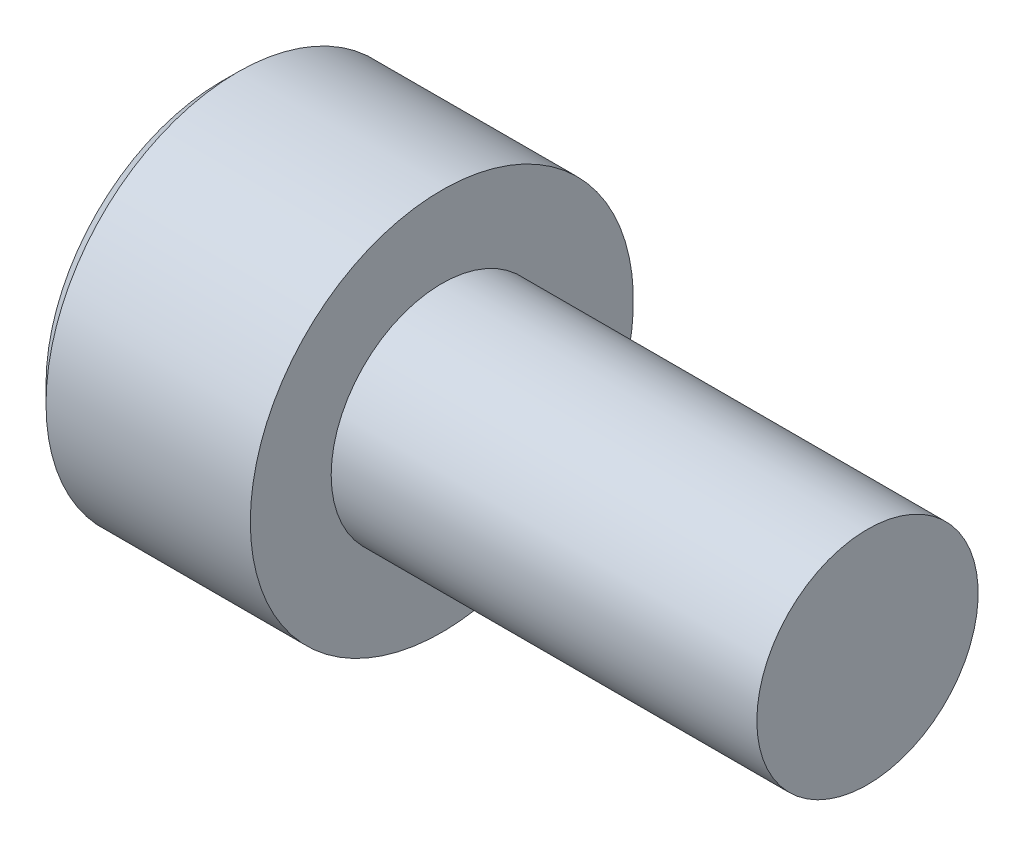
ISO-10303-21;
HEADER;
FILE_DESCRIPTION(('STEP AP214'),'2;1');
FILE_NAME('part.step','',(''),(''),'','','');
FILE_SCHEMA(('AUTOMOTIVE_DESIGN { 1 0 10303 214 1 1 1 1 }'));
ENDSEC;
DATA;
#1=APPLICATION_CONTEXT('core data for automotive mechanical design processes');
#2=APPLICATION_PROTOCOL_DEFINITION('international standard','automotive_design',2000,#1);
#3=PRODUCT_CONTEXT('',#1,'mechanical');
#4=PRODUCT('Part','Part','',(#3));
#5=PRODUCT_RELATED_PRODUCT_CATEGORY('part','',(#4));
#6=PRODUCT_DEFINITION_FORMATION('','',#4);
#7=PRODUCT_DEFINITION_CONTEXT('part definition',#1,'design');
#8=PRODUCT_DEFINITION('design','',#6,#7);
#9=PRODUCT_DEFINITION_SHAPE('','',#8);
#10=(LENGTH_UNIT() NAMED_UNIT(*) SI_UNIT(.MILLI.,.METRE.));
#11=(NAMED_UNIT(*) PLANE_ANGLE_UNIT() SI_UNIT($,.RADIAN.));
#12=(NAMED_UNIT(*) SI_UNIT($,.STERADIAN.) SOLID_ANGLE_UNIT());
#13=UNCERTAINTY_MEASURE_WITH_UNIT(LENGTH_MEASURE(1.E-05),#10,'distance_accuracy_value','');
#14=(GEOMETRIC_REPRESENTATION_CONTEXT(3) GLOBAL_UNCERTAINTY_ASSIGNED_CONTEXT((#13)) GLOBAL_UNIT_ASSIGNED_CONTEXT((#10,
#11,#12)) REPRESENTATION_CONTEXT('',''));
#15=CARTESIAN_POINT('',(0.,0.,0.));
#16=DIRECTION('',(0.,0.,1.));
#17=DIRECTION('',(1.,0.,0.));
#18=AXIS2_PLACEMENT_3D('',#15,#16,#17);
#19=CARTESIAN_POINT('',(-2.6,2.25,0.));
#20=DIRECTION('',(1.,0.,0.));
#21=DIRECTION('',(0.,0.,-1.));
#22=AXIS2_PLACEMENT_3D('',#19,#20,#21);
#23=PLANE('',#22);
#24=CARTESIAN_POINT('',(-2.6,0.,0.));
#25=DIRECTION('',(1.,0.,0.));
#26=DIRECTION('',(0.,0.,-1.));
#27=AXIS2_PLACEMENT_3D('',#24,#25,#26);
#28=CIRCLE('',#27,2.05);
#29=CARTESIAN_POINT('',(-2.6,0.,-2.05));
#30=VERTEX_POINT('',#29);
#31=EDGE_CURVE('E53',#30,#30,#28,.F.);
#32=ORIENTED_EDGE('',*,*,#31,.T.);
#33=EDGE_LOOP('',(#32));
#34=FACE_BOUND('',#33,.T.);
#35=DIRECTION('',(0.,0.5,0.866025403784439));
#36=VECTOR('',#35,1.);
#37=CARTESIAN_POINT('',(-2.6,-1.15470053837925,0.));
#38=LINE('',#37,#36);
#39=CARTESIAN_POINT('',(-2.6,-1.15470053837925,0.));
#40=VERTEX_POINT('',#39);
#41=CARTESIAN_POINT('',(-2.6,-0.577350269189626,1.));
#42=VERTEX_POINT('',#41);
#43=EDGE_CURVE('E171',#40,#42,#38,.T.);
#44=ORIENTED_EDGE('',*,*,#43,.F.);
#45=DIRECTION('',(0.,-0.5,0.866025403784439));
#46=VECTOR('',#45,1.);
#47=CARTESIAN_POINT('',(-2.6,-0.577350269189626,-1.));
#48=LINE('',#47,#46);
#49=CARTESIAN_POINT('',(-2.6,-0.577350269189626,-1.));
#50=VERTEX_POINT('',#49);
#51=EDGE_CURVE('E60',#50,#40,#48,.T.);
#52=ORIENTED_EDGE('',*,*,#51,.F.);
#53=DIRECTION('',(0.,-1.,0.));
#54=VECTOR('',#53,1.);
#55=CARTESIAN_POINT('',(-2.6,0.577350269189626,-1.));
#56=LINE('',#55,#54);
#57=CARTESIAN_POINT('',(-2.6,0.577350269189626,-1.));
#58=VERTEX_POINT('',#57);
#59=EDGE_CURVE('E131',#58,#50,#56,.T.);
#60=ORIENTED_EDGE('',*,*,#59,.F.);
#61=DIRECTION('',(0.,-0.5,-0.866025403784439));
#62=VECTOR('',#61,1.);
#63=CARTESIAN_POINT('',(-2.6,1.15470053837925,0.));
#64=LINE('',#63,#62);
#65=CARTESIAN_POINT('',(-2.6,1.15470053837925,0.));
#66=VERTEX_POINT('',#65);
#67=EDGE_CURVE('E180',#66,#58,#64,.T.);
#68=ORIENTED_EDGE('',*,*,#67,.F.);
#69=DIRECTION('',(0.,0.5,-0.866025403784439));
#70=VECTOR('',#69,1.);
#71=CARTESIAN_POINT('',(-2.6,0.577350269189626,1.));
#72=LINE('',#71,#70);
#73=CARTESIAN_POINT('',(-2.6,0.577350269189626,1.));
#74=VERTEX_POINT('',#73);
#75=EDGE_CURVE('E177',#74,#66,#72,.T.);
#76=ORIENTED_EDGE('',*,*,#75,.F.);
#77=DIRECTION('',(0.,1.,0.));
#78=VECTOR('',#77,1.);
#79=CARTESIAN_POINT('',(-2.6,-0.577350269189626,1.));
#80=LINE('',#79,#78);
#81=EDGE_CURVE('E174',#42,#74,#80,.T.);
#82=ORIENTED_EDGE('',*,*,#81,.F.);
#83=EDGE_LOOP('',(#44,#52,#60,#68,#76,#82));
#84=FACE_BOUND('',#83,.T.);
#85=ADVANCED_FACE('F44',(#34,#84),#23,.F.);
#86=CARTESIAN_POINT('',(5.,0.,0.));
#87=DIRECTION('',(-1.,0.,0.));
#88=DIRECTION('',(0.,0.,1.));
#89=AXIS2_PLACEMENT_3D('',#86,#87,#88);
#90=PLANE('',#89);
#91=CARTESIAN_POINT('',(5.,0.,0.));
#92=DIRECTION('',(-1.,0.,0.));
#93=DIRECTION('',(0.,0.,1.));
#94=AXIS2_PLACEMENT_3D('',#91,#92,#93);
#95=CIRCLE('',#94,1.3);
#96=CARTESIAN_POINT('',(5.,0.,1.3));
#97=VERTEX_POINT('',#96);
#98=EDGE_CURVE('E216',#97,#97,#95,.T.);
#99=ORIENTED_EDGE('',*,*,#98,.F.);
#100=EDGE_LOOP('',(#99));
#101=FACE_BOUND('',#100,.T.);
#102=ADVANCED_FACE('F240',(#101),#90,.F.);
#103=CARTESIAN_POINT('',(-2.6,0.,0.));
#104=DIRECTION('',(-1.,0.,0.));
#105=DIRECTION('',(0.,0.,1.));
#106=AXIS2_PLACEMENT_3D('',#103,#104,#105);
#107=CYLINDRICAL_SURFACE('',#106,1.3);
#108=CARTESIAN_POINT('',(0.,0.,0.));
#109=DIRECTION('',(-1.,0.,0.));
#110=DIRECTION('',(0.,0.,1.));
#111=AXIS2_PLACEMENT_3D('',#108,#109,#110);
#112=CIRCLE('',#111,1.3);
#113=CARTESIAN_POINT('',(0.,0.,1.3));
#114=VERTEX_POINT('',#113);
#115=EDGE_CURVE('E212',#114,#114,#112,.T.);
#116=ORIENTED_EDGE('',*,*,#115,.F.);
#117=EDGE_LOOP('',(#116));
#118=FACE_BOUND('',#117,.T.);
#119=ORIENTED_EDGE('',*,*,#98,.T.);
#120=EDGE_LOOP('',(#119));
#121=FACE_BOUND('',#120,.T.);
#122=ADVANCED_FACE('F244',(#118,#121),#107,.T.);
#123=CARTESIAN_POINT('',(0.,1.3,0.));
#124=DIRECTION('',(-1.,0.,0.));
#125=DIRECTION('',(0.,0.,1.));
#126=AXIS2_PLACEMENT_3D('',#123,#124,#125);
#127=PLANE('',#126);
#128=CARTESIAN_POINT('',(0.,0.,0.));
#129=DIRECTION('',(-1.,0.,0.));
#130=DIRECTION('',(0.,0.,1.));
#131=AXIS2_PLACEMENT_3D('',#128,#129,#130);
#132=CIRCLE('',#131,2.25);
#133=CARTESIAN_POINT('',(0.,0.,2.25));
#134=VERTEX_POINT('',#133);
#135=EDGE_CURVE('E207',#134,#134,#132,.T.);
#136=ORIENTED_EDGE('',*,*,#135,.F.);
#137=EDGE_LOOP('',(#136));
#138=FACE_BOUND('',#137,.T.);
#139=ORIENTED_EDGE('',*,*,#115,.T.);
#140=EDGE_LOOP('',(#139));
#141=FACE_BOUND('',#140,.T.);
#142=ADVANCED_FACE('F235',(#138,#141),#127,.F.);
#143=CARTESIAN_POINT('',(-2.6,0.,0.));
#144=DIRECTION('',(-1.,0.,0.));
#145=DIRECTION('',(0.,0.,1.));
#146=AXIS2_PLACEMENT_3D('',#143,#144,#145);
#147=CYLINDRICAL_SURFACE('',#146,2.25);
#148=CARTESIAN_POINT('',(-2.4,0.,0.));
#149=DIRECTION('',(1.,0.,0.));
#150=DIRECTION('',(0.,0.,-1.));
#151=AXIS2_PLACEMENT_3D('',#148,#149,#150);
#152=CIRCLE('',#151,2.25);
#153=CARTESIAN_POINT('',(-2.4,0.,-2.25));
#154=VERTEX_POINT('',#153);
#155=EDGE_CURVE('E11',#154,#154,#152,.T.);
#156=ORIENTED_EDGE('',*,*,#155,.T.);
#157=EDGE_LOOP('',(#156));
#158=FACE_BOUND('',#157,.T.);
#159=ORIENTED_EDGE('',*,*,#135,.T.);
#160=EDGE_LOOP('',(#159));
#161=FACE_BOUND('',#160,.T.);
#162=ADVANCED_FACE('F227',(#158,#161),#147,.T.);
#163=CARTESIAN_POINT('',(-2.6,0.,0.));
#164=DIRECTION('',(1.,0.,0.));
#165=DIRECTION('',(0.,0.,-1.));
#166=AXIS2_PLACEMENT_3D('',#163,#164,#165);
#167=CONICAL_SURFACE('',#166,2.05,0.785398163397444);
#168=ORIENTED_EDGE('',*,*,#155,.F.);
#169=EDGE_LOOP('',(#168));
#170=FACE_BOUND('',#169,.T.);
#171=ORIENTED_EDGE('',*,*,#31,.F.);
#172=EDGE_LOOP('',(#171));
#173=FACE_BOUND('',#172,.T.);
#174=ADVANCED_FACE('F46',(#170,#173),#167,.T.);
#175=CARTESIAN_POINT('',(-1.5,-0.577350269189626,-1.));
#176=DIRECTION('',(0.,-0.866025403784439,-0.5));
#177=DIRECTION('',(0.,0.5,-0.866025403784439));
#178=AXIS2_PLACEMENT_3D('',#175,#176,#177);
#179=PLANE('',#178);
#180=DIRECTION('',(0.,-0.5,0.866025403784439));
#181=VECTOR('',#180,1.);
#182=CARTESIAN_POINT('',(-1.5,-0.577350269189626,-1.));
#183=LINE('',#182,#181);
#184=CARTESIAN_POINT('',(-1.5,-0.577350269189626,-1.));
#185=VERTEX_POINT('',#184);
#186=CARTESIAN_POINT('',(-1.5,-0.866025403784438,-0.5));
#187=VERTEX_POINT('',#186);
#188=EDGE_CURVE('E130',#185,#187,#183,.T.);
#189=ORIENTED_EDGE('',*,*,#188,.F.);
#190=DIRECTION('',(-1.,0.,0.));
#191=VECTOR('',#190,1.);
#192=CARTESIAN_POINT('',(-1.5,-0.577350269189626,-1.));
#193=LINE('',#192,#191);
#194=EDGE_CURVE('E185',#185,#50,#193,.T.);
#195=ORIENTED_EDGE('',*,*,#194,.T.);
#196=ORIENTED_EDGE('',*,*,#51,.T.);
#197=DIRECTION('',(-1.,0.,0.));
#198=VECTOR('',#197,1.);
#199=CARTESIAN_POINT('',(-1.5,-1.15470053837925,0.));
#200=LINE('',#199,#198);
#201=CARTESIAN_POINT('',(-1.5,-1.15470053837925,0.));
#202=VERTEX_POINT('',#201);
#203=EDGE_CURVE('E133',#202,#40,#200,.T.);
#204=ORIENTED_EDGE('',*,*,#203,.F.);
#205=EDGE_CURVE('E121',#187,#202,#183,.T.);
#206=ORIENTED_EDGE('',*,*,#205,.F.);
#207=EDGE_LOOP('',(#189,#195,#196,#204,#206));
#208=FACE_BOUND('',#207,.T.);
#209=ADVANCED_FACE('F134',(#208),#179,.F.);
#210=CARTESIAN_POINT('',(-1.5,0.577350269189626,-1.));
#211=DIRECTION('',(0.,0.,-1.));
#212=DIRECTION('',(-1.,0.,0.));
#213=AXIS2_PLACEMENT_3D('',#210,#211,#212);
#214=PLANE('',#213);
#215=DIRECTION('',(0.,-1.,0.));
#216=VECTOR('',#215,1.);
#217=CARTESIAN_POINT('',(-1.5,0.577350269189626,-1.));
#218=LINE('',#217,#216);
#219=CARTESIAN_POINT('',(-1.5,0.577350269189626,-1.));
#220=VERTEX_POINT('',#219);
#221=CARTESIAN_POINT('',(-1.5,0.,-1.));
#222=VERTEX_POINT('',#221);
#223=EDGE_CURVE('E140',#220,#222,#218,.T.);
#224=ORIENTED_EDGE('',*,*,#223,.F.);
#225=DIRECTION('',(-1.,0.,0.));
#226=VECTOR('',#225,1.);
#227=CARTESIAN_POINT('',(-1.5,0.577350269189626,-1.));
#228=LINE('',#227,#226);
#229=EDGE_CURVE('E188',#220,#58,#228,.T.);
#230=ORIENTED_EDGE('',*,*,#229,.T.);
#231=ORIENTED_EDGE('',*,*,#59,.T.);
#232=ORIENTED_EDGE('',*,*,#194,.F.);
#233=EDGE_CURVE('E165',#222,#185,#218,.T.);
#234=ORIENTED_EDGE('',*,*,#233,.F.);
#235=EDGE_LOOP('',(#224,#230,#231,#232,#234));
#236=FACE_BOUND('',#235,.T.);
#237=ADVANCED_FACE('F233',(#236),#214,.F.);
#238=CARTESIAN_POINT('',(-1.5,1.15470053837925,0.));
#239=DIRECTION('',(0.,0.866025403784439,-0.5));
#240=DIRECTION('',(0.,0.5,0.866025403784439));
#241=AXIS2_PLACEMENT_3D('',#238,#239,#240);
#242=PLANE('',#241);
#243=DIRECTION('',(0.,-0.5,-0.866025403784439));
#244=VECTOR('',#243,1.);
#245=CARTESIAN_POINT('',(-1.5,1.15470053837925,0.));
#246=LINE('',#245,#244);
#247=CARTESIAN_POINT('',(-1.5,1.15470053837925,0.));
#248=VERTEX_POINT('',#247);
#249=CARTESIAN_POINT('',(-1.5,0.866025403784439,-0.5));
#250=VERTEX_POINT('',#249);
#251=EDGE_CURVE('E161',#248,#250,#246,.T.);
#252=ORIENTED_EDGE('',*,*,#251,.F.);
#253=DIRECTION('',(-1.,0.,0.));
#254=VECTOR('',#253,1.);
#255=CARTESIAN_POINT('',(-1.5,1.15470053837925,0.));
#256=LINE('',#255,#254);
#257=EDGE_CURVE('E192',#248,#66,#256,.T.);
#258=ORIENTED_EDGE('',*,*,#257,.T.);
#259=ORIENTED_EDGE('',*,*,#67,.T.);
#260=ORIENTED_EDGE('',*,*,#229,.F.);
#261=EDGE_CURVE('E160',#250,#220,#246,.T.);
#262=ORIENTED_EDGE('',*,*,#261,.F.);
#263=EDGE_LOOP('',(#252,#258,#259,#260,#262));
#264=FACE_BOUND('',#263,.T.);
#265=ADVANCED_FACE('F269',(#264),#242,.F.);
#266=CARTESIAN_POINT('',(-1.5,0.577350269189626,1.));
#267=DIRECTION('',(0.,0.866025403784439,0.5));
#268=DIRECTION('',(0.,-0.5,0.866025403784439));
#269=AXIS2_PLACEMENT_3D('',#266,#267,#268);
#270=PLANE('',#269);
#271=DIRECTION('',(0.,0.5,-0.866025403784439));
#272=VECTOR('',#271,1.);
#273=CARTESIAN_POINT('',(-1.5,0.577350269189626,1.));
#274=LINE('',#273,#272);
#275=CARTESIAN_POINT('',(-1.5,0.577350269189626,1.));
#276=VERTEX_POINT('',#275);
#277=CARTESIAN_POINT('',(-1.5,0.866025403784439,0.499999999999999));
#278=VERTEX_POINT('',#277);
#279=EDGE_CURVE('E156',#276,#278,#274,.T.);
#280=ORIENTED_EDGE('',*,*,#279,.F.);
#281=DIRECTION('',(-1.,0.,0.));
#282=VECTOR('',#281,1.);
#283=CARTESIAN_POINT('',(-1.5,0.577350269189626,1.));
#284=LINE('',#283,#282);
#285=EDGE_CURVE('E196',#276,#74,#284,.T.);
#286=ORIENTED_EDGE('',*,*,#285,.T.);
#287=ORIENTED_EDGE('',*,*,#75,.T.);
#288=ORIENTED_EDGE('',*,*,#257,.F.);
#289=EDGE_CURVE('E155',#278,#248,#274,.T.);
#290=ORIENTED_EDGE('',*,*,#289,.F.);
#291=EDGE_LOOP('',(#280,#286,#287,#288,#290));
#292=FACE_BOUND('',#291,.T.);
#293=ADVANCED_FACE('F265',(#292),#270,.F.);
#294=CARTESIAN_POINT('',(-1.5,-0.577350269189626,1.));
#295=DIRECTION('',(0.,0.,1.));
#296=DIRECTION('',(1.,0.,0.));
#297=AXIS2_PLACEMENT_3D('',#294,#295,#296);
#298=PLANE('',#297);
#299=DIRECTION('',(0.,1.,0.));
#300=VECTOR('',#299,1.);
#301=CARTESIAN_POINT('',(-1.5,-0.577350269189626,1.));
#302=LINE('',#301,#300);
#303=CARTESIAN_POINT('',(-1.5,-0.577350269189626,1.));
#304=VERTEX_POINT('',#303);
#305=CARTESIAN_POINT('',(-1.5,0.,1.));
#306=VERTEX_POINT('',#305);
#307=EDGE_CURVE('E68',#304,#306,#302,.T.);
#308=ORIENTED_EDGE('',*,*,#307,.F.);
#309=DIRECTION('',(-1.,0.,0.));
#310=VECTOR('',#309,1.);
#311=CARTESIAN_POINT('',(-1.5,-0.577350269189626,1.));
#312=LINE('',#311,#310);
#313=EDGE_CURVE('E139',#304,#42,#312,.T.);
#314=ORIENTED_EDGE('',*,*,#313,.T.);
#315=ORIENTED_EDGE('',*,*,#81,.T.);
#316=ORIENTED_EDGE('',*,*,#285,.F.);
#317=EDGE_CURVE('E147',#306,#276,#302,.T.);
#318=ORIENTED_EDGE('',*,*,#317,.F.);
#319=EDGE_LOOP('',(#308,#314,#315,#316,#318));
#320=FACE_BOUND('',#319,.T.);
#321=ADVANCED_FACE('F262',(#320),#298,.F.);
#322=CARTESIAN_POINT('',(-1.5,-1.15470053837925,0.));
#323=DIRECTION('',(0.,-0.866025403784439,0.5));
#324=DIRECTION('',(0.,-0.5,-0.866025403784439));
#325=AXIS2_PLACEMENT_3D('',#322,#323,#324);
#326=PLANE('',#325);
#327=DIRECTION('',(0.,0.5,0.866025403784439));
#328=VECTOR('',#327,1.);
#329=CARTESIAN_POINT('',(-1.5,-1.15470053837925,0.));
#330=LINE('',#329,#328);
#331=CARTESIAN_POINT('',(-1.5,-0.866025403784439,0.5));
#332=VERTEX_POINT('',#331);
#333=EDGE_CURVE('E124',#202,#332,#330,.T.);
#334=ORIENTED_EDGE('',*,*,#333,.F.);
#335=ORIENTED_EDGE('',*,*,#203,.T.);
#336=ORIENTED_EDGE('',*,*,#43,.T.);
#337=ORIENTED_EDGE('',*,*,#313,.F.);
#338=EDGE_CURVE('E145',#332,#304,#330,.T.);
#339=ORIENTED_EDGE('',*,*,#338,.F.);
#340=EDGE_LOOP('',(#334,#335,#336,#337,#339));
#341=FACE_BOUND('',#340,.T.);
#342=ADVANCED_FACE('F143',(#341),#326,.F.);
#343=CARTESIAN_POINT('',(-1.5,0.,0.));
#344=DIRECTION('',(-1.,0.,0.));
#345=DIRECTION('',(0.,0.,1.));
#346=AXIS2_PLACEMENT_3D('',#343,#344,#345);
#347=PLANE('',#346);
#348=ORIENTED_EDGE('',*,*,#317,.T.);
#349=ORIENTED_EDGE('',*,*,#279,.T.);
#350=CARTESIAN_POINT('',(-1.5,0.,0.));
#351=DIRECTION('',(-1.,0.,0.));
#352=DIRECTION('',(0.,-1.,0.));
#353=AXIS2_PLACEMENT_3D('',#350,#351,#352);
#354=CIRCLE('',#353,1.);
#355=EDGE_CURVE('E208',#306,#278,#354,.T.);
#356=ORIENTED_EDGE('',*,*,#355,.F.);
#357=EDGE_LOOP('',(#348,#349,#356));
#358=FACE_BOUND('',#357,.T.);
#359=ADVANCED_FACE('F261',(#358),#347,.T.);
#360=ORIENTED_EDGE('',*,*,#289,.T.);
#361=ORIENTED_EDGE('',*,*,#251,.T.);
#362=EDGE_CURVE('E326',#278,#250,#354,.T.);
#363=ORIENTED_EDGE('',*,*,#362,.F.);
#364=EDGE_LOOP('',(#360,#361,#363));
#365=FACE_BOUND('',#364,.T.);
#366=ADVANCED_FACE('F283',(#365),#347,.T.);
#367=ORIENTED_EDGE('',*,*,#261,.T.);
#368=ORIENTED_EDGE('',*,*,#223,.T.);
#369=EDGE_CURVE('E322',#250,#222,#354,.T.);
#370=ORIENTED_EDGE('',*,*,#369,.F.);
#371=EDGE_LOOP('',(#367,#368,#370));
#372=FACE_BOUND('',#371,.T.);
#373=ADVANCED_FACE('F288',(#372),#347,.T.);
#374=ORIENTED_EDGE('',*,*,#233,.T.);
#375=ORIENTED_EDGE('',*,*,#188,.T.);
#376=EDGE_CURVE('E318',#222,#187,#354,.T.);
#377=ORIENTED_EDGE('',*,*,#376,.F.);
#378=EDGE_LOOP('',(#374,#375,#377));
#379=FACE_BOUND('',#378,.T.);
#380=ADVANCED_FACE('F281',(#379),#347,.T.);
#381=ORIENTED_EDGE('',*,*,#205,.T.);
#382=ORIENTED_EDGE('',*,*,#333,.T.);
#383=EDGE_CURVE('E126',#187,#332,#354,.T.);
#384=ORIENTED_EDGE('',*,*,#383,.F.);
#385=EDGE_LOOP('',(#381,#382,#384));
#386=FACE_BOUND('',#385,.T.);
#387=ADVANCED_FACE('F122',(#386),#347,.T.);
#388=ORIENTED_EDGE('',*,*,#338,.T.);
#389=ORIENTED_EDGE('',*,*,#307,.T.);
#390=EDGE_CURVE('E203',#332,#306,#354,.T.);
#391=ORIENTED_EDGE('',*,*,#390,.F.);
#392=EDGE_LOOP('',(#388,#389,#391));
#393=FACE_BOUND('',#392,.T.);
#394=ADVANCED_FACE('F256',(#393),#347,.T.);
#395=CARTESIAN_POINT('',(-0.899139380972433,0.,0.));
#396=DIRECTION('',(-1.,0.,0.));
#397=DIRECTION('',(0.,-1.,0.));
#398=AXIS2_PLACEMENT_3D('',#395,#396,#397);
#399=CONICAL_SURFACE('',#398,0.,1.02974425867665);
#400=ORIENTED_EDGE('',*,*,#390,.T.);
#401=ORIENTED_EDGE('',*,*,#355,.T.);
#402=ORIENTED_EDGE('',*,*,#362,.T.);
#403=ORIENTED_EDGE('',*,*,#369,.T.);
#404=ORIENTED_EDGE('',*,*,#376,.T.);
#405=ORIENTED_EDGE('',*,*,#383,.T.);
#406=EDGE_LOOP('',(#400,#401,#402,#403,#404,#405));
#407=FACE_BOUND('',#406,.T.);
#408=CARTESIAN_POINT('',(-0.899139380972433,0.,0.));
#409=VERTEX_POINT('',#408);
#410=VERTEX_LOOP('',#409);
#411=FACE_BOUND('',#410,.T.);
#412=ADVANCED_FACE('F254',(#407,#411),#399,.F.);
#413=CLOSED_SHELL('',(#85,#102,#122,#142,#162,#174,#209,#237,#265,#293,#321,#342,#359,#366,#373,
#380,#387,#394,#412));
#414=MANIFOLD_SOLID_BREP('B2',#413);
#415=ADVANCED_BREP_SHAPE_REPRESENTATION('',(#18,#414),#14);
#416=SHAPE_DEFINITION_REPRESENTATION(#9,#415);
ENDSEC;
END-ISO-10303-21;
